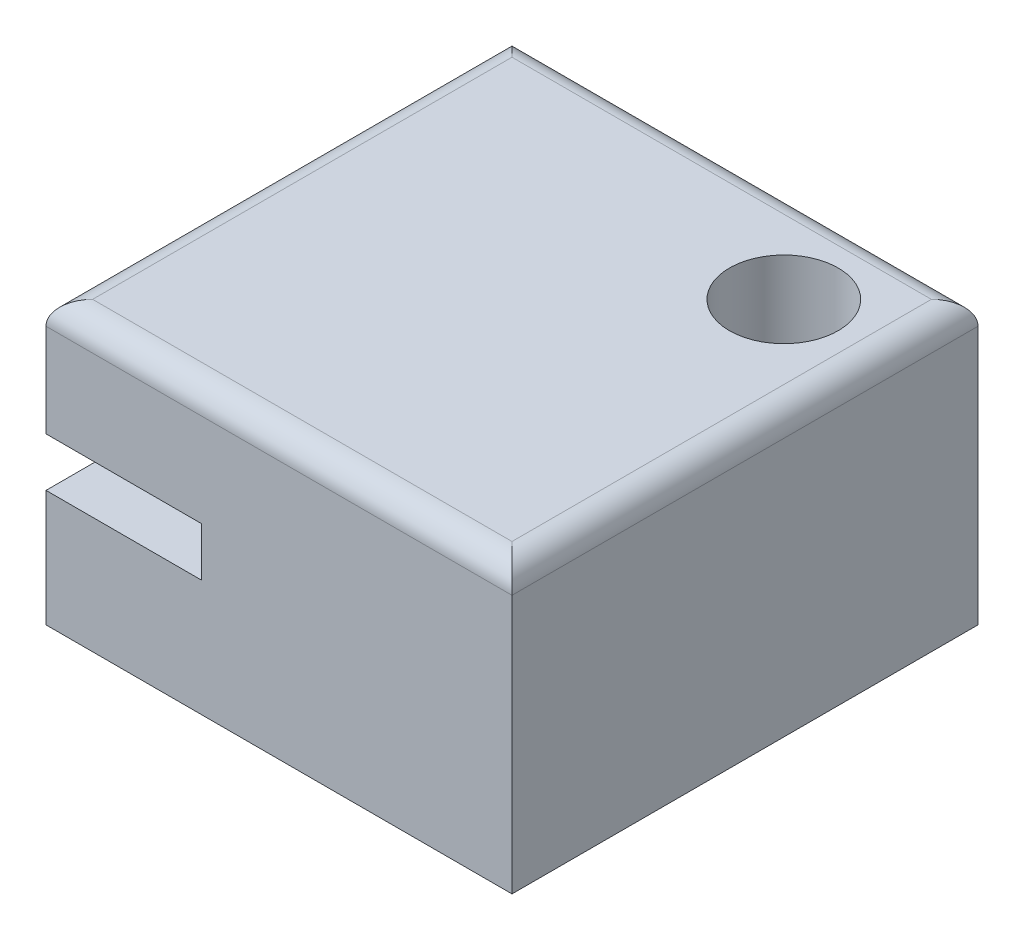
ISO-10303-21;
HEADER;
FILE_DESCRIPTION(('STEP AP214'),'2;1');
FILE_NAME('part.step','',(''),(''),'','','');
FILE_SCHEMA(('AUTOMOTIVE_DESIGN { 1 0 10303 214 1 1 1 1 }'));
ENDSEC;
DATA;
#1=APPLICATION_CONTEXT('core data for automotive mechanical design processes');
#2=APPLICATION_PROTOCOL_DEFINITION('international standard','automotive_design',2000,#1);
#3=PRODUCT_CONTEXT('',#1,'mechanical');
#4=PRODUCT('Part','Part','',(#3));
#5=PRODUCT_RELATED_PRODUCT_CATEGORY('part','',(#4));
#6=PRODUCT_DEFINITION_FORMATION('','',#4);
#7=PRODUCT_DEFINITION_CONTEXT('part definition',#1,'design');
#8=PRODUCT_DEFINITION('design','',#6,#7);
#9=PRODUCT_DEFINITION_SHAPE('','',#8);
#10=(LENGTH_UNIT() NAMED_UNIT(*) SI_UNIT(.MILLI.,.METRE.));
#11=(NAMED_UNIT(*) PLANE_ANGLE_UNIT() SI_UNIT($,.RADIAN.));
#12=(NAMED_UNIT(*) SI_UNIT($,.STERADIAN.) SOLID_ANGLE_UNIT());
#13=UNCERTAINTY_MEASURE_WITH_UNIT(LENGTH_MEASURE(1.E-05),#10,'distance_accuracy_value','');
#14=(GEOMETRIC_REPRESENTATION_CONTEXT(3) GLOBAL_UNCERTAINTY_ASSIGNED_CONTEXT((#13)) GLOBAL_UNIT_ASSIGNED_CONTEXT((#10,
#11,#12)) REPRESENTATION_CONTEXT('',''));
#15=CARTESIAN_POINT('',(0.,0.,0.));
#16=DIRECTION('',(0.,0.,1.));
#17=DIRECTION('',(1.,0.,0.));
#18=AXIS2_PLACEMENT_3D('',#15,#16,#17);
#19=CARTESIAN_POINT('',(0.,3.81,0.));
#20=DIRECTION('',(0.,-1.,0.));
#21=DIRECTION('',(0.,0.,-1.));
#22=AXIS2_PLACEMENT_3D('',#19,#20,#21);
#23=PLANE('',#22);
#24=DIRECTION('',(0.,0.,1.));
#25=VECTOR('',#24,1.);
#26=CARTESIAN_POINT('',(-3.72202926829269,3.81,2.54));
#27=LINE('',#26,#25);
#28=CARTESIAN_POINT('',(-3.72202926829269,3.81,2.54));
#29=VERTEX_POINT('',#28);
#30=CARTESIAN_POINT('',(-3.72202926829269,3.81,7.62));
#31=VERTEX_POINT('',#30);
#32=EDGE_CURVE('E131',#29,#31,#27,.T.);
#33=ORIENTED_EDGE('',*,*,#32,.F.);
#34=DIRECTION('',(1.,0.,0.));
#35=VECTOR('',#34,1.);
#36=CARTESIAN_POINT('',(-8.80202926829269,3.81,2.54));
#37=LINE('',#36,#35);
#38=CARTESIAN_POINT('',(-8.80202926829269,3.81,2.54));
#39=VERTEX_POINT('',#38);
#40=EDGE_CURVE('E155',#39,#29,#37,.T.);
#41=ORIENTED_EDGE('',*,*,#40,.F.);
#42=DIRECTION('',(0.,0.,1.));
#43=VECTOR('',#42,1.);
#44=CARTESIAN_POINT('',(-8.80202926829269,3.81,7.62));
#45=LINE('',#44,#43);
#46=CARTESIAN_POINT('',(-8.80202926829269,3.81,7.62));
#47=VERTEX_POINT('',#46);
#48=EDGE_CURVE('E174',#39,#47,#45,.T.);
#49=ORIENTED_EDGE('',*,*,#48,.T.);
#50=DIRECTION('',(1.,0.,0.));
#51=VECTOR('',#50,1.);
#52=CARTESIAN_POINT('',(-8.80202926829269,3.81,7.62));
#53=LINE('',#52,#51);
#54=EDGE_CURVE('E177',#47,#31,#53,.T.);
#55=ORIENTED_EDGE('',*,*,#54,.T.);
#56=EDGE_LOOP('',(#33,#41,#49,#55));
#57=FACE_BOUND('',#56,.T.);
#58=ADVANCED_FACE('F45',(#57),#23,.F.);
#59=CARTESIAN_POINT('',(6.43797073170731,3.81,7.62));
#60=DIRECTION('',(-1.,0.,0.));
#61=DIRECTION('',(0.,0.,1.));
#62=AXIS2_PLACEMENT_3D('',#59,#60,#61);
#63=PLANE('',#62);
#64=DIRECTION('',(0.,-1.,0.));
#65=VECTOR('',#64,1.);
#66=CARTESIAN_POINT('',(6.43797073170731,3.81,-7.62));
#67=LINE('',#66,#65);
#68=CARTESIAN_POINT('',(6.43797073170731,8.4582,-7.62));
#69=VERTEX_POINT('',#68);
#70=CARTESIAN_POINT('',(6.43797073170731,0.,-7.62));
#71=VERTEX_POINT('',#70);
#72=EDGE_CURVE('E204',#69,#71,#67,.T.);
#73=ORIENTED_EDGE('',*,*,#72,.F.);
#74=DIRECTION('',(0.,0.,-1.));
#75=VECTOR('',#74,1.);
#76=CARTESIAN_POINT('',(6.43797073170731,8.4582,7.62));
#77=LINE('',#76,#75);
#78=CARTESIAN_POINT('',(6.43797073170731,8.4582,7.62));
#79=VERTEX_POINT('',#78);
#80=EDGE_CURVE('E70',#69,#79,#77,.F.);
#81=ORIENTED_EDGE('',*,*,#80,.T.);
#82=DIRECTION('',(0.,-1.,0.));
#83=VECTOR('',#82,1.);
#84=CARTESIAN_POINT('',(6.43797073170731,3.81,7.62));
#85=LINE('',#84,#83);
#86=CARTESIAN_POINT('',(6.43797073170731,0.,7.62));
#87=VERTEX_POINT('',#86);
#88=EDGE_CURVE('E181',#79,#87,#85,.T.);
#89=ORIENTED_EDGE('',*,*,#88,.T.);
#90=DIRECTION('',(0.,0.,-1.));
#91=VECTOR('',#90,1.);
#92=CARTESIAN_POINT('',(6.43797073170731,0.,7.62));
#93=LINE('',#92,#91);
#94=EDGE_CURVE('E173',#87,#71,#93,.T.);
#95=ORIENTED_EDGE('',*,*,#94,.T.);
#96=EDGE_LOOP('',(#73,#81,#89,#95));
#97=FACE_BOUND('',#96,.T.);
#98=ADVANCED_FACE('F272',(#97),#63,.F.);
#99=CARTESIAN_POINT('',(-8.80202926829269,3.81,-7.62));
#100=DIRECTION('',(0.,0.,1.));
#101=DIRECTION('',(1.,0.,0.));
#102=AXIS2_PLACEMENT_3D('',#99,#100,#101);
#103=PLANE('',#102);
#104=DIRECTION('',(0.,-1.,0.));
#105=VECTOR('',#104,1.);
#106=CARTESIAN_POINT('',(-8.80202926829269,3.81,-7.62));
#107=LINE('',#106,#105);
#108=CARTESIAN_POINT('',(-8.80202926829269,8.4582,-7.62));
#109=VERTEX_POINT('',#108);
#110=CARTESIAN_POINT('',(-8.80202926829269,0.,-7.62));
#111=VERTEX_POINT('',#110);
#112=EDGE_CURVE('E201',#109,#111,#107,.T.);
#113=ORIENTED_EDGE('',*,*,#112,.F.);
#114=DIRECTION('',(-1.,0.,0.));
#115=VECTOR('',#114,1.);
#116=CARTESIAN_POINT('',(-8.80202926829269,8.4582,-7.62));
#117=LINE('',#116,#115);
#118=EDGE_CURVE('E220',#109,#69,#117,.F.);
#119=ORIENTED_EDGE('',*,*,#118,.T.);
#120=ORIENTED_EDGE('',*,*,#72,.T.);
#121=DIRECTION('',(-1.,0.,0.));
#122=VECTOR('',#121,1.);
#123=CARTESIAN_POINT('',(-8.80202926829269,0.,-7.62));
#124=LINE('',#123,#122);
#125=EDGE_CURVE('E185',#71,#111,#124,.T.);
#126=ORIENTED_EDGE('',*,*,#125,.T.);
#127=EDGE_LOOP('',(#113,#119,#120,#126));
#128=FACE_BOUND('',#127,.T.);
#129=ADVANCED_FACE('F278',(#128),#103,.F.);
#130=CARTESIAN_POINT('',(-8.80202926829269,3.81,7.62));
#131=DIRECTION('',(1.,0.,0.));
#132=DIRECTION('',(0.,0.,-1.));
#133=AXIS2_PLACEMENT_3D('',#130,#131,#132);
#134=PLANE('',#133);
#135=DIRECTION('',(0.,-1.,0.));
#136=VECTOR('',#135,1.);
#137=CARTESIAN_POINT('',(-8.80202926829269,9.2202,7.62));
#138=LINE('',#137,#136);
#139=CARTESIAN_POINT('',(-8.80202926829269,8.4582,7.62));
#140=VERTEX_POINT('',#139);
#141=CARTESIAN_POINT('',(-8.80202926829269,5.4102,7.62));
#142=VERTEX_POINT('',#141);
#143=EDGE_CURVE('E122',#140,#142,#138,.T.);
#144=ORIENTED_EDGE('',*,*,#143,.F.);
#145=DIRECTION('',(0.,0.,1.));
#146=VECTOR('',#145,1.);
#147=CARTESIAN_POINT('',(-8.80202926829269,8.4582,7.62));
#148=LINE('',#147,#146);
#149=EDGE_CURVE('E11',#140,#109,#148,.F.);
#150=ORIENTED_EDGE('',*,*,#149,.T.);
#151=ORIENTED_EDGE('',*,*,#112,.T.);
#152=DIRECTION('',(0.,0.,1.));
#153=VECTOR('',#152,1.);
#154=CARTESIAN_POINT('',(-8.80202926829269,0.,7.62));
#155=LINE('',#154,#153);
#156=CARTESIAN_POINT('',(-8.80202926829269,0.,7.62));
#157=VERTEX_POINT('',#156);
#158=EDGE_CURVE('E189',#111,#157,#155,.T.);
#159=ORIENTED_EDGE('',*,*,#158,.T.);
#160=DIRECTION('',(0.,-1.,0.));
#161=VECTOR('',#160,1.);
#162=CARTESIAN_POINT('',(-8.80202926829269,3.81,7.62));
#163=LINE('',#162,#161);
#164=EDGE_CURVE('E197',#47,#157,#163,.T.);
#165=ORIENTED_EDGE('',*,*,#164,.F.);
#166=ORIENTED_EDGE('',*,*,#48,.F.);
#167=DIRECTION('',(0.,-1.,0.));
#168=VECTOR('',#167,1.);
#169=CARTESIAN_POINT('',(-8.80202926829269,5.4102,2.54));
#170=LINE('',#169,#168);
#171=CARTESIAN_POINT('',(-8.80202926829269,5.4102,2.54));
#172=VERTEX_POINT('',#171);
#173=EDGE_CURVE('E138',#172,#39,#170,.T.);
#174=ORIENTED_EDGE('',*,*,#173,.F.);
#175=DIRECTION('',(0.,0.,1.));
#176=VECTOR('',#175,1.);
#177=CARTESIAN_POINT('',(-8.80202926829269,5.4102,7.62));
#178=LINE('',#177,#176);
#179=EDGE_CURVE('E134',#172,#142,#178,.T.);
#180=ORIENTED_EDGE('',*,*,#179,.T.);
#181=EDGE_LOOP('',(#144,#150,#151,#159,#165,#166,#174,#180));
#182=FACE_BOUND('',#181,.T.);
#183=ADVANCED_FACE('F135',(#182),#134,.F.);
#184=CARTESIAN_POINT('',(-8.80202926829269,3.81,7.62));
#185=DIRECTION('',(0.,0.,-1.));
#186=DIRECTION('',(-1.,0.,0.));
#187=AXIS2_PLACEMENT_3D('',#184,#185,#186);
#188=PLANE('',#187);
#189=ORIENTED_EDGE('',*,*,#88,.F.);
#190=DIRECTION('',(1.,0.,0.));
#191=VECTOR('',#190,1.);
#192=CARTESIAN_POINT('',(-8.80202926829269,8.4582,7.62));
#193=LINE('',#192,#191);
#194=EDGE_CURVE('E55',#79,#140,#193,.F.);
#195=ORIENTED_EDGE('',*,*,#194,.T.);
#196=ORIENTED_EDGE('',*,*,#143,.T.);
#197=DIRECTION('',(1.,0.,0.));
#198=VECTOR('',#197,1.);
#199=CARTESIAN_POINT('',(-8.80202926829269,5.4102,7.62));
#200=LINE('',#199,#198);
#201=CARTESIAN_POINT('',(-3.72202926829269,5.4102,7.62));
#202=VERTEX_POINT('',#201);
#203=EDGE_CURVE('E127',#142,#202,#200,.T.);
#204=ORIENTED_EDGE('',*,*,#203,.T.);
#205=DIRECTION('',(0.,-1.,0.));
#206=VECTOR('',#205,1.);
#207=CARTESIAN_POINT('',(-3.72202926829269,5.4102,7.62));
#208=LINE('',#207,#206);
#209=EDGE_CURVE('E170',#202,#31,#208,.T.);
#210=ORIENTED_EDGE('',*,*,#209,.T.);
#211=ORIENTED_EDGE('',*,*,#54,.F.);
#212=ORIENTED_EDGE('',*,*,#164,.T.);
#213=DIRECTION('',(1.,0.,0.));
#214=VECTOR('',#213,1.);
#215=CARTESIAN_POINT('',(-8.80202926829269,0.,7.62));
#216=LINE('',#215,#214);
#217=EDGE_CURVE('E178',#157,#87,#216,.T.);
#218=ORIENTED_EDGE('',*,*,#217,.T.);
#219=EDGE_LOOP('',(#189,#195,#196,#204,#210,#211,#212,#218));
#220=FACE_BOUND('',#219,.T.);
#221=ADVANCED_FACE('F124',(#220),#188,.F.);
#222=CARTESIAN_POINT('',(0.,0.,0.));
#223=DIRECTION('',(0.,-1.,0.));
#224=DIRECTION('',(0.,0.,-1.));
#225=AXIS2_PLACEMENT_3D('',#222,#223,#224);
#226=PLANE('',#225);
#227=CARTESIAN_POINT('',(3.26297073170731,0.,-4.445));
#228=DIRECTION('',(0.,1.,0.));
#229=DIRECTION('',(0.,0.,1.));
#230=AXIS2_PLACEMENT_3D('',#227,#228,#229);
#231=CIRCLE('',#230,1.778);
#232=CARTESIAN_POINT('',(3.26297073170731,0.,-2.667));
#233=VERTEX_POINT('',#232);
#234=EDGE_CURVE('E143',#233,#233,#231,.T.);
#235=ORIENTED_EDGE('',*,*,#234,.T.);
#236=EDGE_LOOP('',(#235));
#237=FACE_BOUND('',#236,.T.);
#238=ORIENTED_EDGE('',*,*,#94,.F.);
#239=ORIENTED_EDGE('',*,*,#217,.F.);
#240=ORIENTED_EDGE('',*,*,#158,.F.);
#241=ORIENTED_EDGE('',*,*,#125,.F.);
#242=EDGE_LOOP('',(#238,#239,#240,#241));
#243=FACE_BOUND('',#242,.T.);
#244=ADVANCED_FACE('F254',(#237,#243),#226,.T.);
#245=CARTESIAN_POINT('',(-3.72202926829269,5.4102,2.54));
#246=DIRECTION('',(1.,0.,0.));
#247=DIRECTION('',(0.,0.,-1.));
#248=AXIS2_PLACEMENT_3D('',#245,#246,#247);
#249=PLANE('',#248);
#250=ORIENTED_EDGE('',*,*,#32,.T.);
#251=ORIENTED_EDGE('',*,*,#209,.F.);
#252=DIRECTION('',(0.,0.,1.));
#253=VECTOR('',#252,1.);
#254=CARTESIAN_POINT('',(-3.72202926829269,5.4102,2.54));
#255=LINE('',#254,#253);
#256=CARTESIAN_POINT('',(-3.72202926829269,5.4102,2.54));
#257=VERTEX_POINT('',#256);
#258=EDGE_CURVE('E147',#257,#202,#255,.T.);
#259=ORIENTED_EDGE('',*,*,#258,.F.);
#260=DIRECTION('',(0.,-1.,0.));
#261=VECTOR('',#260,1.);
#262=CARTESIAN_POINT('',(-3.72202926829269,5.4102,2.54));
#263=LINE('',#262,#261);
#264=EDGE_CURVE('E158',#257,#29,#263,.T.);
#265=ORIENTED_EDGE('',*,*,#264,.T.);
#266=EDGE_LOOP('',(#250,#251,#259,#265));
#267=FACE_BOUND('',#266,.T.);
#268=ADVANCED_FACE('F282',(#267),#249,.F.);
#269=CARTESIAN_POINT('',(-8.80202926829269,5.4102,2.54));
#270=DIRECTION('',(0.,0.,-1.));
#271=DIRECTION('',(-1.,0.,0.));
#272=AXIS2_PLACEMENT_3D('',#269,#270,#271);
#273=PLANE('',#272);
#274=ORIENTED_EDGE('',*,*,#40,.T.);
#275=ORIENTED_EDGE('',*,*,#264,.F.);
#276=DIRECTION('',(1.,0.,0.));
#277=VECTOR('',#276,1.);
#278=CARTESIAN_POINT('',(-8.80202926829269,5.4102,2.54));
#279=LINE('',#278,#277);
#280=EDGE_CURVE('E154',#172,#257,#279,.T.);
#281=ORIENTED_EDGE('',*,*,#280,.F.);
#282=ORIENTED_EDGE('',*,*,#173,.T.);
#283=EDGE_LOOP('',(#274,#275,#281,#282));
#284=FACE_BOUND('',#283,.T.);
#285=ADVANCED_FACE('F337',(#284),#273,.F.);
#286=CARTESIAN_POINT('',(0.,9.2202,0.));
#287=DIRECTION('',(0.,-1.,0.));
#288=DIRECTION('',(0.,0.,-1.));
#289=AXIS2_PLACEMENT_3D('',#286,#287,#288);
#290=PLANE('',#289);
#291=DIRECTION('',(0.,0.,-1.));
#292=VECTOR('',#291,1.);
#293=CARTESIAN_POINT('',(5.67597073170731,9.2202,0.));
#294=LINE('',#293,#292);
#295=CARTESIAN_POINT('',(5.67597073170731,9.2202,6.858));
#296=VERTEX_POINT('',#295);
#297=CARTESIAN_POINT('',(5.67597073170731,9.2202,-6.858));
#298=VERTEX_POINT('',#297);
#299=EDGE_CURVE('E213',#296,#298,#294,.T.);
#300=ORIENTED_EDGE('',*,*,#299,.T.);
#301=DIRECTION('',(-1.,0.,0.));
#302=VECTOR('',#301,1.);
#303=CARTESIAN_POINT('',(0.,9.2202,-6.858));
#304=LINE('',#303,#302);
#305=CARTESIAN_POINT('',(-8.04002926829269,9.2202,-6.858));
#306=VERTEX_POINT('',#305);
#307=EDGE_CURVE('E216',#298,#306,#304,.T.);
#308=ORIENTED_EDGE('',*,*,#307,.T.);
#309=DIRECTION('',(0.,0.,1.));
#310=VECTOR('',#309,1.);
#311=CARTESIAN_POINT('',(-8.04002926829269,9.2202,0.));
#312=LINE('',#311,#310);
#313=CARTESIAN_POINT('',(-8.04002926829269,9.2202,6.858));
#314=VERTEX_POINT('',#313);
#315=EDGE_CURVE('E207',#306,#314,#312,.T.);
#316=ORIENTED_EDGE('',*,*,#315,.T.);
#317=DIRECTION('',(1.,0.,0.));
#318=VECTOR('',#317,1.);
#319=CARTESIAN_POINT('',(0.,9.2202,6.858));
#320=LINE('',#319,#318);
#321=EDGE_CURVE('E210',#314,#296,#320,.T.);
#322=ORIENTED_EDGE('',*,*,#321,.T.);
#323=EDGE_LOOP('',(#300,#308,#316,#322));
#324=FACE_BOUND('',#323,.T.);
#325=CARTESIAN_POINT('',(3.26297073170731,9.2202,-4.445));
#326=DIRECTION('',(0.,1.,0.));
#327=DIRECTION('',(0.,0.,1.));
#328=AXIS2_PLACEMENT_3D('',#325,#326,#327);
#329=CIRCLE('',#328,1.778);
#330=CARTESIAN_POINT('',(3.26297073170731,9.2202,-2.667));
#331=VERTEX_POINT('',#330);
#332=EDGE_CURVE('E241',#331,#331,#329,.T.);
#333=ORIENTED_EDGE('',*,*,#332,.F.);
#334=EDGE_LOOP('',(#333));
#335=FACE_BOUND('',#334,.T.);
#336=ADVANCED_FACE('F268',(#324,#335),#290,.F.);
#337=CARTESIAN_POINT('',(0.,5.4102,0.));
#338=DIRECTION('',(0.,-1.,0.));
#339=DIRECTION('',(0.,0.,-1.));
#340=AXIS2_PLACEMENT_3D('',#337,#338,#339);
#341=PLANE('',#340);
#342=ORIENTED_EDGE('',*,*,#280,.T.);
#343=ORIENTED_EDGE('',*,*,#258,.T.);
#344=ORIENTED_EDGE('',*,*,#203,.F.);
#345=ORIENTED_EDGE('',*,*,#179,.F.);
#346=EDGE_LOOP('',(#342,#343,#344,#345));
#347=FACE_BOUND('',#346,.T.);
#348=ADVANCED_FACE('F146',(#347),#341,.T.);
#349=CARTESIAN_POINT('',(3.26297073170731,0.,-4.445));
#350=DIRECTION('',(0.,1.,0.));
#351=DIRECTION('',(0.,0.,1.));
#352=AXIS2_PLACEMENT_3D('',#349,#350,#351);
#353=CYLINDRICAL_SURFACE('',#352,1.778);
#354=ORIENTED_EDGE('',*,*,#234,.F.);
#355=EDGE_LOOP('',(#354));
#356=FACE_BOUND('',#355,.T.);
#357=ORIENTED_EDGE('',*,*,#332,.T.);
#358=EDGE_LOOP('',(#357));
#359=FACE_BOUND('',#358,.T.);
#360=ADVANCED_FACE('F257',(#356,#359),#353,.F.);
#361=CARTESIAN_POINT('',(0.,8.4582,6.858));
#362=DIRECTION('',(1.,0.,0.));
#363=DIRECTION('',(0.,0.,-1.));
#364=AXIS2_PLACEMENT_3D('',#361,#362,#363);
#365=CYLINDRICAL_SURFACE('',#364,0.762);
#366=CARTESIAN_POINT('',(-8.04002926829269,8.4582,6.858));
#367=DIRECTION('',(0.707106781186547,0.,0.707106781186547));
#368=DIRECTION('',(-0.707106781186547,0.,0.707106781186547));
#369=AXIS2_PLACEMENT_3D('',#366,#367,#368);
#370=ELLIPSE('',#369,1.0776307345283,0.762);
#371=EDGE_CURVE('E233',#140,#314,#370,.F.);
#372=ORIENTED_EDGE('',*,*,#371,.F.);
#373=ORIENTED_EDGE('',*,*,#194,.F.);
#374=CARTESIAN_POINT('',(5.67597073170731,8.4582,6.858));
#375=DIRECTION('',(0.707106781186547,0.,-0.707106781186547));
#376=DIRECTION('',(0.707106781186547,0.,0.707106781186547));
#377=AXIS2_PLACEMENT_3D('',#374,#375,#376);
#378=ELLIPSE('',#377,1.0776307345283,0.762);
#379=EDGE_CURVE('E49',#296,#79,#378,.T.);
#380=ORIENTED_EDGE('',*,*,#379,.F.);
#381=ORIENTED_EDGE('',*,*,#321,.F.);
#382=EDGE_LOOP('',(#372,#373,#380,#381));
#383=FACE_BOUND('',#382,.T.);
#384=ADVANCED_FACE('F47',(#383),#365,.T.);
#385=CARTESIAN_POINT('',(5.67597073170731,8.4582,0.));
#386=DIRECTION('',(0.,0.,-1.));
#387=DIRECTION('',(-1.,0.,0.));
#388=AXIS2_PLACEMENT_3D('',#385,#386,#387);
#389=CYLINDRICAL_SURFACE('',#388,0.762);
#390=ORIENTED_EDGE('',*,*,#379,.T.);
#391=ORIENTED_EDGE('',*,*,#80,.F.);
#392=CARTESIAN_POINT('',(5.67597073170731,8.4582,-6.858));
#393=DIRECTION('',(-0.707106781186547,0.,-0.707106781186547));
#394=DIRECTION('',(0.707106781186547,0.,-0.707106781186547));
#395=AXIS2_PLACEMENT_3D('',#392,#393,#394);
#396=ELLIPSE('',#395,1.0776307345283,0.762);
#397=EDGE_CURVE('E231',#298,#69,#396,.T.);
#398=ORIENTED_EDGE('',*,*,#397,.F.);
#399=ORIENTED_EDGE('',*,*,#299,.F.);
#400=EDGE_LOOP('',(#390,#391,#398,#399));
#401=FACE_BOUND('',#400,.T.);
#402=ADVANCED_FACE('F265',(#401),#389,.T.);
#403=CARTESIAN_POINT('',(-8.04002926829269,8.4582,0.));
#404=DIRECTION('',(0.,0.,1.));
#405=DIRECTION('',(1.,0.,0.));
#406=AXIS2_PLACEMENT_3D('',#403,#404,#405);
#407=CYLINDRICAL_SURFACE('',#406,0.762);
#408=ORIENTED_EDGE('',*,*,#371,.T.);
#409=ORIENTED_EDGE('',*,*,#315,.F.);
#410=CARTESIAN_POINT('',(-8.04002926829269,8.4582,-6.858));
#411=DIRECTION('',(-0.707106781186547,0.,0.707106781186547));
#412=DIRECTION('',(0.707106781186547,0.,0.707106781186547));
#413=AXIS2_PLACEMENT_3D('',#410,#411,#412);
#414=ELLIPSE('',#413,1.0776307345283,0.762);
#415=EDGE_CURVE('E228',#109,#306,#414,.F.);
#416=ORIENTED_EDGE('',*,*,#415,.F.);
#417=ORIENTED_EDGE('',*,*,#149,.F.);
#418=EDGE_LOOP('',(#408,#409,#416,#417));
#419=FACE_BOUND('',#418,.T.);
#420=ADVANCED_FACE('F295',(#419),#407,.T.);
#421=CARTESIAN_POINT('',(0.,8.4582,-6.858));
#422=DIRECTION('',(-1.,0.,0.));
#423=DIRECTION('',(0.,0.,1.));
#424=AXIS2_PLACEMENT_3D('',#421,#422,#423);
#425=CYLINDRICAL_SURFACE('',#424,0.762);
#426=ORIENTED_EDGE('',*,*,#397,.T.);
#427=ORIENTED_EDGE('',*,*,#118,.F.);
#428=ORIENTED_EDGE('',*,*,#415,.T.);
#429=ORIENTED_EDGE('',*,*,#307,.F.);
#430=EDGE_LOOP('',(#426,#427,#428,#429));
#431=FACE_BOUND('',#430,.T.);
#432=ADVANCED_FACE('F292',(#431),#425,.T.);
#433=CLOSED_SHELL('',(#58,#98,#129,#183,#221,#244,#268,#285,#336,#348,#360,#384,#402,#420,#432));
#434=MANIFOLD_SOLID_BREP('B2',#433);
#435=ADVANCED_BREP_SHAPE_REPRESENTATION('',(#18,#434),#14);
#436=SHAPE_DEFINITION_REPRESENTATION(#9,#435);
ENDSEC;
END-ISO-10303-21;
